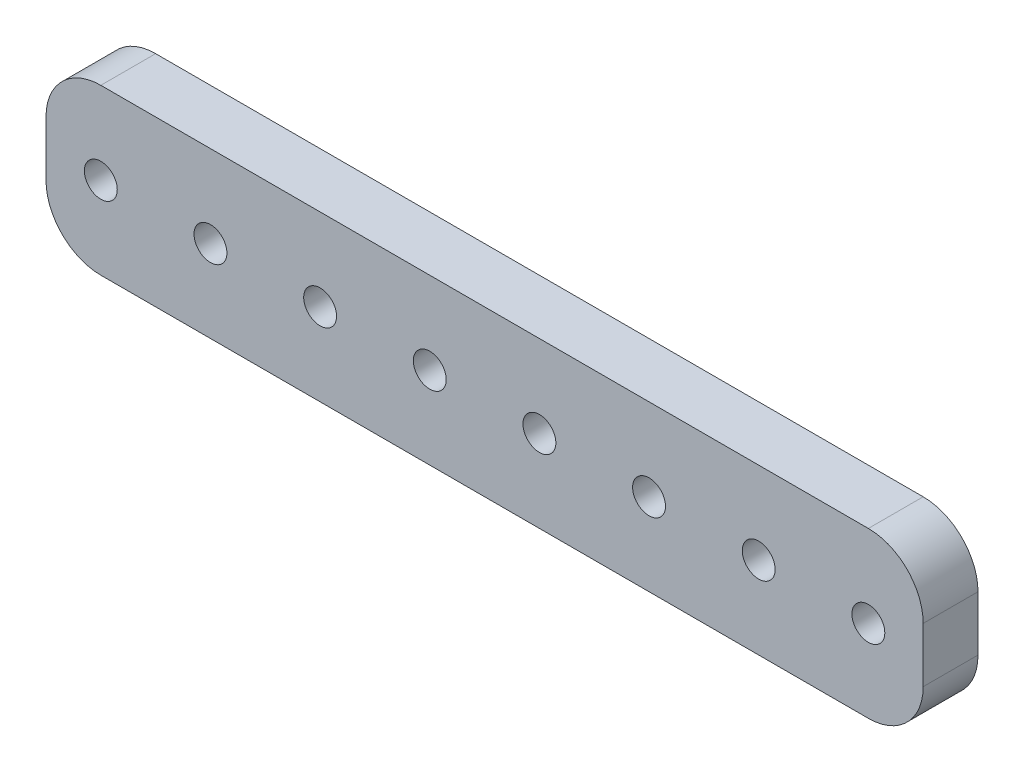
ISO-10303-21;
HEADER;
FILE_DESCRIPTION(('STEP AP214'),'2;1');
FILE_NAME('part.step','',(''),(''),'','','');
FILE_SCHEMA(('AUTOMOTIVE_DESIGN { 1 0 10303 214 1 1 1 1 }'));
ENDSEC;
DATA;
#1=APPLICATION_CONTEXT('core data for automotive mechanical design processes');
#2=APPLICATION_PROTOCOL_DEFINITION('international standard','automotive_design',2000,#1);
#3=PRODUCT_CONTEXT('',#1,'mechanical');
#4=PRODUCT('Part','Part','',(#3));
#5=PRODUCT_RELATED_PRODUCT_CATEGORY('part','',(#4));
#6=PRODUCT_DEFINITION_FORMATION('','',#4);
#7=PRODUCT_DEFINITION_CONTEXT('part definition',#1,'design');
#8=PRODUCT_DEFINITION('design','',#6,#7);
#9=PRODUCT_DEFINITION_SHAPE('','',#8);
#10=(LENGTH_UNIT() NAMED_UNIT(*) SI_UNIT(.MILLI.,.METRE.));
#11=(NAMED_UNIT(*) PLANE_ANGLE_UNIT() SI_UNIT($,.RADIAN.));
#12=(NAMED_UNIT(*) SI_UNIT($,.STERADIAN.) SOLID_ANGLE_UNIT());
#13=UNCERTAINTY_MEASURE_WITH_UNIT(LENGTH_MEASURE(1.E-05),#10,'distance_accuracy_value','');
#14=(GEOMETRIC_REPRESENTATION_CONTEXT(3) GLOBAL_UNCERTAINTY_ASSIGNED_CONTEXT((#13)) GLOBAL_UNIT_ASSIGNED_CONTEXT((#10,
#11,#12)) REPRESENTATION_CONTEXT('',''));
#15=CARTESIAN_POINT('',(0.,0.,0.));
#16=DIRECTION('',(0.,0.,1.));
#17=DIRECTION('',(1.,0.,0.));
#18=AXIS2_PLACEMENT_3D('',#15,#16,#17);
#19=CARTESIAN_POINT('',(80.,15.,10.));
#20=DIRECTION('',(-1.,0.,0.));
#21=DIRECTION('',(0.,0.,1.));
#22=AXIS2_PLACEMENT_3D('',#19,#20,#21);
#23=PLANE('',#22);
#24=DIRECTION('',(0.,1.,0.));
#25=VECTOR('',#24,1.);
#26=CARTESIAN_POINT('',(80.,15.,10.));
#27=LINE('',#26,#25);
#28=CARTESIAN_POINT('',(80.,-5.,10.));
#29=VERTEX_POINT('',#28);
#30=CARTESIAN_POINT('',(80.,5.,10.));
#31=VERTEX_POINT('',#30);
#32=EDGE_CURVE('E120',#29,#31,#27,.T.);
#33=ORIENTED_EDGE('',*,*,#32,.F.);
#34=DIRECTION('',(0.,0.,-1.));
#35=VECTOR('',#34,1.);
#36=CARTESIAN_POINT('',(80.,-5.,10.));
#37=LINE('',#36,#35);
#38=CARTESIAN_POINT('',(80.,-5.,0.));
#39=VERTEX_POINT('',#38);
#40=EDGE_CURVE('E105',#29,#39,#37,.T.);
#41=ORIENTED_EDGE('',*,*,#40,.T.);
#42=DIRECTION('',(0.,1.,0.));
#43=VECTOR('',#42,1.);
#44=CARTESIAN_POINT('',(80.,15.,0.));
#45=LINE('',#44,#43);
#46=CARTESIAN_POINT('',(80.,5.,0.));
#47=VERTEX_POINT('',#46);
#48=EDGE_CURVE('E117',#39,#47,#45,.T.);
#49=ORIENTED_EDGE('',*,*,#48,.T.);
#50=DIRECTION('',(0.,0.,-1.));
#51=VECTOR('',#50,1.);
#52=CARTESIAN_POINT('',(80.,5.,10.));
#53=LINE('',#52,#51);
#54=EDGE_CURVE('E122',#47,#31,#53,.F.);
#55=ORIENTED_EDGE('',*,*,#54,.T.);
#56=EDGE_LOOP('',(#33,#41,#49,#55));
#57=FACE_BOUND('',#56,.T.);
#58=ADVANCED_FACE('F35',(#57),#23,.F.);
#59=CARTESIAN_POINT('',(-80.,15.,10.));
#60=DIRECTION('',(0.,-1.,0.));
#61=DIRECTION('',(0.,0.,-1.));
#62=AXIS2_PLACEMENT_3D('',#59,#60,#61);
#63=PLANE('',#62);
#64=DIRECTION('',(-1.,0.,0.));
#65=VECTOR('',#64,1.);
#66=CARTESIAN_POINT('',(-80.,15.,0.));
#67=LINE('',#66,#65);
#68=CARTESIAN_POINT('',(70.,15.,0.));
#69=VERTEX_POINT('',#68);
#70=CARTESIAN_POINT('',(-70.,15.,0.));
#71=VERTEX_POINT('',#70);
#72=EDGE_CURVE('E126',#69,#71,#67,.T.);
#73=ORIENTED_EDGE('',*,*,#72,.T.);
#74=DIRECTION('',(0.,0.,-1.));
#75=VECTOR('',#74,1.);
#76=CARTESIAN_POINT('',(-70.,15.,10.));
#77=LINE('',#76,#75);
#78=CARTESIAN_POINT('',(-70.,15.,10.));
#79=VERTEX_POINT('',#78);
#80=EDGE_CURVE('E12',#71,#79,#77,.F.);
#81=ORIENTED_EDGE('',*,*,#80,.T.);
#82=DIRECTION('',(-1.,0.,0.));
#83=VECTOR('',#82,1.);
#84=CARTESIAN_POINT('',(-80.,15.,10.));
#85=LINE('',#84,#83);
#86=CARTESIAN_POINT('',(70.,15.,10.));
#87=VERTEX_POINT('',#86);
#88=EDGE_CURVE('E166',#87,#79,#85,.T.);
#89=ORIENTED_EDGE('',*,*,#88,.F.);
#90=DIRECTION('',(0.,0.,-1.));
#91=VECTOR('',#90,1.);
#92=CARTESIAN_POINT('',(70.,15.,10.));
#93=LINE('',#92,#91);
#94=EDGE_CURVE('E43',#87,#69,#93,.T.);
#95=ORIENTED_EDGE('',*,*,#94,.T.);
#96=EDGE_LOOP('',(#73,#81,#89,#95));
#97=FACE_BOUND('',#96,.T.);
#98=ADVANCED_FACE('F164',(#97),#63,.F.);
#99=CARTESIAN_POINT('',(-80.,15.,10.));
#100=DIRECTION('',(1.,0.,0.));
#101=DIRECTION('',(0.,0.,-1.));
#102=AXIS2_PLACEMENT_3D('',#99,#100,#101);
#103=PLANE('',#102);
#104=DIRECTION('',(0.,-1.,0.));
#105=VECTOR('',#104,1.);
#106=CARTESIAN_POINT('',(-80.,15.,0.));
#107=LINE('',#106,#105);
#108=CARTESIAN_POINT('',(-80.,5.,0.));
#109=VERTEX_POINT('',#108);
#110=CARTESIAN_POINT('',(-80.,-5.,0.));
#111=VERTEX_POINT('',#110);
#112=EDGE_CURVE('E130',#109,#111,#107,.T.);
#113=ORIENTED_EDGE('',*,*,#112,.T.);
#114=DIRECTION('',(0.,0.,-1.));
#115=VECTOR('',#114,1.);
#116=CARTESIAN_POINT('',(-80.,-5.,10.));
#117=LINE('',#116,#115);
#118=CARTESIAN_POINT('',(-80.,-5.,10.));
#119=VERTEX_POINT('',#118);
#120=EDGE_CURVE('E50',#111,#119,#117,.F.);
#121=ORIENTED_EDGE('',*,*,#120,.T.);
#122=DIRECTION('',(0.,-1.,0.));
#123=VECTOR('',#122,1.);
#124=CARTESIAN_POINT('',(-80.,15.,10.));
#125=LINE('',#124,#123);
#126=CARTESIAN_POINT('',(-80.,5.,10.));
#127=VERTEX_POINT('',#126);
#128=EDGE_CURVE('E174',#127,#119,#125,.T.);
#129=ORIENTED_EDGE('',*,*,#128,.F.);
#130=DIRECTION('',(0.,0.,-1.));
#131=VECTOR('',#130,1.);
#132=CARTESIAN_POINT('',(-80.,5.,10.));
#133=LINE('',#132,#131);
#134=EDGE_CURVE('E157',#127,#109,#133,.T.);
#135=ORIENTED_EDGE('',*,*,#134,.T.);
#136=EDGE_LOOP('',(#113,#121,#129,#135));
#137=FACE_BOUND('',#136,.T.);
#138=ADVANCED_FACE('F173',(#137),#103,.F.);
#139=CARTESIAN_POINT('',(-80.,-15.,10.));
#140=DIRECTION('',(0.,1.,0.));
#141=DIRECTION('',(0.,0.,1.));
#142=AXIS2_PLACEMENT_3D('',#139,#140,#141);
#143=PLANE('',#142);
#144=DIRECTION('',(1.,0.,0.));
#145=VECTOR('',#144,1.);
#146=CARTESIAN_POINT('',(-80.,-15.,0.));
#147=LINE('',#146,#145);
#148=CARTESIAN_POINT('',(-70.,-15.,0.));
#149=VERTEX_POINT('',#148);
#150=CARTESIAN_POINT('',(70.,-15.,0.));
#151=VERTEX_POINT('',#150);
#152=EDGE_CURVE('E140',#149,#151,#147,.T.);
#153=ORIENTED_EDGE('',*,*,#152,.T.);
#154=DIRECTION('',(0.,0.,-1.));
#155=VECTOR('',#154,1.);
#156=CARTESIAN_POINT('',(70.,-15.,10.));
#157=LINE('',#156,#155);
#158=CARTESIAN_POINT('',(70.,-15.,10.));
#159=VERTEX_POINT('',#158);
#160=EDGE_CURVE('E106',#151,#159,#157,.F.);
#161=ORIENTED_EDGE('',*,*,#160,.T.);
#162=DIRECTION('',(1.,0.,0.));
#163=VECTOR('',#162,1.);
#164=CARTESIAN_POINT('',(-80.,-15.,10.));
#165=LINE('',#164,#163);
#166=CARTESIAN_POINT('',(-70.,-15.,10.));
#167=VERTEX_POINT('',#166);
#168=EDGE_CURVE('E136',#167,#159,#165,.T.);
#169=ORIENTED_EDGE('',*,*,#168,.F.);
#170=DIRECTION('',(0.,0.,-1.));
#171=VECTOR('',#170,1.);
#172=CARTESIAN_POINT('',(-70.,-15.,10.));
#173=LINE('',#172,#171);
#174=EDGE_CURVE('E111',#167,#149,#173,.T.);
#175=ORIENTED_EDGE('',*,*,#174,.T.);
#176=EDGE_LOOP('',(#153,#161,#169,#175));
#177=FACE_BOUND('',#176,.T.);
#178=ADVANCED_FACE('F230',(#177),#143,.F.);
#179=CARTESIAN_POINT('',(0.,0.,10.));
#180=DIRECTION('',(0.,0.,1.));
#181=DIRECTION('',(1.,0.,0.));
#182=AXIS2_PLACEMENT_3D('',#179,#180,#181);
#183=PLANE('',#182);
#184=CARTESIAN_POINT('',(9.99999999999997,0.,10.));
#185=DIRECTION('',(0.,0.,1.));
#186=DIRECTION('',(1.,0.,0.));
#187=AXIS2_PLACEMENT_3D('',#184,#185,#186);
#188=CIRCLE('',#187,3.);
#189=CARTESIAN_POINT('',(13.,0.,10.));
#190=VERTEX_POINT('',#189);
#191=EDGE_CURVE('E221',#190,#190,#188,.T.);
#192=ORIENTED_EDGE('',*,*,#191,.F.);
#193=EDGE_LOOP('',(#192));
#194=FACE_BOUND('',#193,.T.);
#195=CARTESIAN_POINT('',(-10.,0.,10.));
#196=DIRECTION('',(0.,0.,1.));
#197=DIRECTION('',(1.,0.,0.));
#198=AXIS2_PLACEMENT_3D('',#195,#196,#197);
#199=CIRCLE('',#198,3.00000000000001);
#200=CARTESIAN_POINT('',(-7.00000000000002,0.,10.));
#201=VERTEX_POINT('',#200);
#202=EDGE_CURVE('E215',#201,#201,#199,.T.);
#203=ORIENTED_EDGE('',*,*,#202,.F.);
#204=EDGE_LOOP('',(#203));
#205=FACE_BOUND('',#204,.T.);
#206=CARTESIAN_POINT('',(70.,0.,10.));
#207=DIRECTION('',(0.,0.,1.));
#208=DIRECTION('',(1.,0.,0.));
#209=AXIS2_PLACEMENT_3D('',#206,#207,#208);
#210=CIRCLE('',#209,2.99999999999999);
#211=CARTESIAN_POINT('',(73.,0.,10.));
#212=VERTEX_POINT('',#211);
#213=EDGE_CURVE('E209',#212,#212,#210,.T.);
#214=ORIENTED_EDGE('',*,*,#213,.F.);
#215=EDGE_LOOP('',(#214));
#216=FACE_BOUND('',#215,.T.);
#217=CARTESIAN_POINT('',(50.,0.,10.));
#218=DIRECTION('',(0.,0.,1.));
#219=DIRECTION('',(1.,0.,0.));
#220=AXIS2_PLACEMENT_3D('',#217,#218,#219);
#221=CIRCLE('',#220,3.00000000000001);
#222=CARTESIAN_POINT('',(53.,0.,10.));
#223=VERTEX_POINT('',#222);
#224=EDGE_CURVE('E203',#223,#223,#221,.T.);
#225=ORIENTED_EDGE('',*,*,#224,.F.);
#226=EDGE_LOOP('',(#225));
#227=FACE_BOUND('',#226,.T.);
#228=CARTESIAN_POINT('',(-50.,0.,10.));
#229=DIRECTION('',(0.,0.,1.));
#230=DIRECTION('',(1.,0.,0.));
#231=AXIS2_PLACEMENT_3D('',#228,#229,#230);
#232=CIRCLE('',#231,3.00000000000001);
#233=CARTESIAN_POINT('',(-47.,0.,10.));
#234=VERTEX_POINT('',#233);
#235=EDGE_CURVE('E197',#234,#234,#232,.T.);
#236=ORIENTED_EDGE('',*,*,#235,.F.);
#237=EDGE_LOOP('',(#236));
#238=FACE_BOUND('',#237,.T.);
#239=CARTESIAN_POINT('',(-70.,0.,10.));
#240=DIRECTION('',(0.,0.,1.));
#241=DIRECTION('',(1.,0.,0.));
#242=AXIS2_PLACEMENT_3D('',#239,#240,#241);
#243=CIRCLE('',#242,2.99999999999999);
#244=CARTESIAN_POINT('',(-67.,0.,10.));
#245=VERTEX_POINT('',#244);
#246=EDGE_CURVE('E191',#245,#245,#243,.T.);
#247=ORIENTED_EDGE('',*,*,#246,.F.);
#248=EDGE_LOOP('',(#247));
#249=FACE_BOUND('',#248,.T.);
#250=CARTESIAN_POINT('',(-30.,0.,10.));
#251=DIRECTION('',(0.,0.,1.));
#252=DIRECTION('',(1.,0.,0.));
#253=AXIS2_PLACEMENT_3D('',#250,#251,#252);
#254=CIRCLE('',#253,3.00000000000001);
#255=CARTESIAN_POINT('',(-27.,0.,10.));
#256=VERTEX_POINT('',#255);
#257=EDGE_CURVE('E185',#256,#256,#254,.T.);
#258=ORIENTED_EDGE('',*,*,#257,.F.);
#259=EDGE_LOOP('',(#258));
#260=FACE_BOUND('',#259,.T.);
#261=CARTESIAN_POINT('',(30.,0.,10.));
#262=DIRECTION('',(0.,0.,1.));
#263=DIRECTION('',(1.,0.,0.));
#264=AXIS2_PLACEMENT_3D('',#261,#262,#263);
#265=CIRCLE('',#264,3.00000000000001);
#266=CARTESIAN_POINT('',(33.,0.,10.));
#267=VERTEX_POINT('',#266);
#268=EDGE_CURVE('E133',#267,#267,#265,.T.);
#269=ORIENTED_EDGE('',*,*,#268,.F.);
#270=EDGE_LOOP('',(#269));
#271=FACE_BOUND('',#270,.T.);
#272=ORIENTED_EDGE('',*,*,#168,.T.);
#273=CARTESIAN_POINT('',(70.,-5.,10.));
#274=DIRECTION('',(0.,0.,1.));
#275=DIRECTION('',(1.,0.,0.));
#276=AXIS2_PLACEMENT_3D('',#273,#274,#275);
#277=CIRCLE('',#276,10.);
#278=EDGE_CURVE('E155',#159,#29,#277,.T.);
#279=ORIENTED_EDGE('',*,*,#278,.T.);
#280=ORIENTED_EDGE('',*,*,#32,.T.);
#281=CARTESIAN_POINT('',(70.,5.,10.));
#282=DIRECTION('',(0.,0.,1.));
#283=DIRECTION('',(1.,0.,0.));
#284=AXIS2_PLACEMENT_3D('',#281,#282,#283);
#285=CIRCLE('',#284,10.);
#286=EDGE_CURVE('E150',#31,#87,#285,.T.);
#287=ORIENTED_EDGE('',*,*,#286,.T.);
#288=ORIENTED_EDGE('',*,*,#88,.T.);
#289=CARTESIAN_POINT('',(-70.,5.,10.));
#290=DIRECTION('',(0.,0.,1.));
#291=DIRECTION('',(1.,0.,0.));
#292=AXIS2_PLACEMENT_3D('',#289,#290,#291);
#293=CIRCLE('',#292,10.);
#294=EDGE_CURVE('E57',#79,#127,#293,.T.);
#295=ORIENTED_EDGE('',*,*,#294,.T.);
#296=ORIENTED_EDGE('',*,*,#128,.T.);
#297=CARTESIAN_POINT('',(-70.,-5.,10.));
#298=DIRECTION('',(0.,0.,1.));
#299=DIRECTION('',(1.,0.,0.));
#300=AXIS2_PLACEMENT_3D('',#297,#298,#299);
#301=CIRCLE('',#300,10.);
#302=EDGE_CURVE('E153',#119,#167,#301,.T.);
#303=ORIENTED_EDGE('',*,*,#302,.T.);
#304=EDGE_LOOP('',(#272,#279,#280,#287,#288,#295,#296,#303));
#305=FACE_BOUND('',#304,.T.);
#306=ADVANCED_FACE('F227',(#194,#205,#216,#227,#238,#249,#260,#271,#305),#183,.T.);
#307=CARTESIAN_POINT('',(0.,0.,0.));
#308=DIRECTION('',(0.,0.,1.));
#309=DIRECTION('',(1.,0.,0.));
#310=AXIS2_PLACEMENT_3D('',#307,#308,#309);
#311=PLANE('',#310);
#312=ORIENTED_EDGE('',*,*,#48,.F.);
#313=CARTESIAN_POINT('',(70.,-5.,0.));
#314=DIRECTION('',(0.,0.,1.));
#315=DIRECTION('',(1.,0.,0.));
#316=AXIS2_PLACEMENT_3D('',#313,#314,#315);
#317=CIRCLE('',#316,10.);
#318=EDGE_CURVE('E101',#39,#151,#317,.F.);
#319=ORIENTED_EDGE('',*,*,#318,.T.);
#320=ORIENTED_EDGE('',*,*,#152,.F.);
#321=CARTESIAN_POINT('',(-70.,-5.,0.));
#322=DIRECTION('',(0.,0.,1.));
#323=DIRECTION('',(1.,0.,0.));
#324=AXIS2_PLACEMENT_3D('',#321,#322,#323);
#325=CIRCLE('',#324,10.);
#326=EDGE_CURVE('E112',#149,#111,#325,.F.);
#327=ORIENTED_EDGE('',*,*,#326,.T.);
#328=ORIENTED_EDGE('',*,*,#112,.F.);
#329=CARTESIAN_POINT('',(-70.,5.,0.));
#330=DIRECTION('',(0.,0.,1.));
#331=DIRECTION('',(1.,0.,0.));
#332=AXIS2_PLACEMENT_3D('',#329,#330,#331);
#333=CIRCLE('',#332,10.);
#334=EDGE_CURVE('E144',#109,#71,#333,.F.);
#335=ORIENTED_EDGE('',*,*,#334,.T.);
#336=ORIENTED_EDGE('',*,*,#72,.F.);
#337=CARTESIAN_POINT('',(70.,5.,0.));
#338=DIRECTION('',(0.,0.,1.));
#339=DIRECTION('',(1.,0.,0.));
#340=AXIS2_PLACEMENT_3D('',#337,#338,#339);
#341=CIRCLE('',#340,10.);
#342=EDGE_CURVE('E121',#69,#47,#341,.F.);
#343=ORIENTED_EDGE('',*,*,#342,.T.);
#344=EDGE_LOOP('',(#312,#319,#320,#327,#328,#335,#336,#343));
#345=FACE_BOUND('',#344,.T.);
#346=ADVANCED_FACE('F124',(#345),#311,.F.);
#347=CARTESIAN_POINT('',(30.,0.,-8.48528137423859));
#348=DIRECTION('',(0.,0.,1.));
#349=DIRECTION('',(1.,0.,0.));
#350=AXIS2_PLACEMENT_3D('',#347,#348,#349);
#351=CYLINDRICAL_SURFACE('',#350,3.00000000000001);
#352=CARTESIAN_POINT('',(30.,0.,0.200000000000001));
#353=DIRECTION('',(0.,0.,1.));
#354=DIRECTION('',(1.,0.,0.));
#355=AXIS2_PLACEMENT_3D('',#352,#353,#354);
#356=CIRCLE('',#355,3.00000000000001);
#357=CARTESIAN_POINT('',(33.,0.,0.200000000000001));
#358=VERTEX_POINT('',#357);
#359=EDGE_CURVE('E127',#358,#358,#356,.F.);
#360=ORIENTED_EDGE('',*,*,#359,.T.);
#361=EDGE_LOOP('',(#360));
#362=FACE_BOUND('',#361,.T.);
#363=ORIENTED_EDGE('',*,*,#268,.T.);
#364=EDGE_LOOP('',(#363));
#365=FACE_BOUND('',#364,.T.);
#366=ADVANCED_FACE('F270',(#362,#365),#351,.F.);
#367=CARTESIAN_POINT('',(0.,0.,0.2));
#368=DIRECTION('',(0.,0.,1.));
#369=DIRECTION('',(1.,0.,0.));
#370=AXIS2_PLACEMENT_3D('',#367,#368,#369);
#371=PLANE('',#370);
#372=ORIENTED_EDGE('',*,*,#359,.F.);
#373=EDGE_LOOP('',(#372));
#374=FACE_BOUND('',#373,.T.);
#375=ADVANCED_FACE('F274',(#374),#371,.T.);
#376=CARTESIAN_POINT('',(-30.,0.,-8.48528137423859));
#377=DIRECTION('',(0.,0.,1.));
#378=DIRECTION('',(1.,0.,0.));
#379=AXIS2_PLACEMENT_3D('',#376,#377,#378);
#380=CYLINDRICAL_SURFACE('',#379,3.00000000000001);
#381=CARTESIAN_POINT('',(-30.,0.,0.200000000000001));
#382=DIRECTION('',(0.,0.,1.));
#383=DIRECTION('',(1.,0.,0.));
#384=AXIS2_PLACEMENT_3D('',#381,#382,#383);
#385=CIRCLE('',#384,3.00000000000001);
#386=CARTESIAN_POINT('',(-27.,0.,0.200000000000001));
#387=VERTEX_POINT('',#386);
#388=EDGE_CURVE('E182',#387,#387,#385,.F.);
#389=ORIENTED_EDGE('',*,*,#388,.T.);
#390=EDGE_LOOP('',(#389));
#391=FACE_BOUND('',#390,.T.);
#392=ORIENTED_EDGE('',*,*,#257,.T.);
#393=EDGE_LOOP('',(#392));
#394=FACE_BOUND('',#393,.T.);
#395=ADVANCED_FACE('F278',(#391,#394),#380,.F.);
#396=CARTESIAN_POINT('',(0.,0.,0.2));
#397=DIRECTION('',(0.,0.,1.));
#398=DIRECTION('',(1.,0.,0.));
#399=AXIS2_PLACEMENT_3D('',#396,#397,#398);
#400=PLANE('',#399);
#401=ORIENTED_EDGE('',*,*,#388,.F.);
#402=EDGE_LOOP('',(#401));
#403=FACE_BOUND('',#402,.T.);
#404=ADVANCED_FACE('F282',(#403),#400,.T.);
#405=CARTESIAN_POINT('',(-70.,0.,-8.48528137423859));
#406=DIRECTION('',(0.,0.,1.));
#407=DIRECTION('',(1.,0.,0.));
#408=AXIS2_PLACEMENT_3D('',#405,#406,#407);
#409=CYLINDRICAL_SURFACE('',#408,2.99999999999999);
#410=CARTESIAN_POINT('',(-70.,0.,0.200000000000001));
#411=DIRECTION('',(0.,0.,1.));
#412=DIRECTION('',(1.,0.,0.));
#413=AXIS2_PLACEMENT_3D('',#410,#411,#412);
#414=CIRCLE('',#413,2.99999999999999);
#415=CARTESIAN_POINT('',(-67.,0.,0.200000000000001));
#416=VERTEX_POINT('',#415);
#417=EDGE_CURVE('E188',#416,#416,#414,.F.);
#418=ORIENTED_EDGE('',*,*,#417,.T.);
#419=EDGE_LOOP('',(#418));
#420=FACE_BOUND('',#419,.T.);
#421=ORIENTED_EDGE('',*,*,#246,.T.);
#422=EDGE_LOOP('',(#421));
#423=FACE_BOUND('',#422,.T.);
#424=ADVANCED_FACE('F286',(#420,#423),#409,.F.);
#425=CARTESIAN_POINT('',(0.,0.,0.2));
#426=DIRECTION('',(0.,0.,1.));
#427=DIRECTION('',(1.,0.,0.));
#428=AXIS2_PLACEMENT_3D('',#425,#426,#427);
#429=PLANE('',#428);
#430=ORIENTED_EDGE('',*,*,#417,.F.);
#431=EDGE_LOOP('',(#430));
#432=FACE_BOUND('',#431,.T.);
#433=ADVANCED_FACE('F290',(#432),#429,.T.);
#434=CARTESIAN_POINT('',(-50.,0.,-8.48528137423859));
#435=DIRECTION('',(0.,0.,1.));
#436=DIRECTION('',(1.,0.,0.));
#437=AXIS2_PLACEMENT_3D('',#434,#435,#436);
#438=CYLINDRICAL_SURFACE('',#437,3.00000000000001);
#439=CARTESIAN_POINT('',(-50.,0.,0.200000000000001));
#440=DIRECTION('',(0.,0.,1.));
#441=DIRECTION('',(1.,0.,0.));
#442=AXIS2_PLACEMENT_3D('',#439,#440,#441);
#443=CIRCLE('',#442,3.00000000000001);
#444=CARTESIAN_POINT('',(-47.,0.,0.200000000000001));
#445=VERTEX_POINT('',#444);
#446=EDGE_CURVE('E194',#445,#445,#443,.F.);
#447=ORIENTED_EDGE('',*,*,#446,.T.);
#448=EDGE_LOOP('',(#447));
#449=FACE_BOUND('',#448,.T.);
#450=ORIENTED_EDGE('',*,*,#235,.T.);
#451=EDGE_LOOP('',(#450));
#452=FACE_BOUND('',#451,.T.);
#453=ADVANCED_FACE('F294',(#449,#452),#438,.F.);
#454=CARTESIAN_POINT('',(0.,0.,0.2));
#455=DIRECTION('',(0.,0.,1.));
#456=DIRECTION('',(1.,0.,0.));
#457=AXIS2_PLACEMENT_3D('',#454,#455,#456);
#458=PLANE('',#457);
#459=ORIENTED_EDGE('',*,*,#446,.F.);
#460=EDGE_LOOP('',(#459));
#461=FACE_BOUND('',#460,.T.);
#462=ADVANCED_FACE('F298',(#461),#458,.T.);
#463=CARTESIAN_POINT('',(50.,0.,-8.48528137423859));
#464=DIRECTION('',(0.,0.,1.));
#465=DIRECTION('',(1.,0.,0.));
#466=AXIS2_PLACEMENT_3D('',#463,#464,#465);
#467=CYLINDRICAL_SURFACE('',#466,3.00000000000001);
#468=CARTESIAN_POINT('',(50.,0.,0.200000000000001));
#469=DIRECTION('',(0.,0.,1.));
#470=DIRECTION('',(1.,0.,0.));
#471=AXIS2_PLACEMENT_3D('',#468,#469,#470);
#472=CIRCLE('',#471,3.00000000000001);
#473=CARTESIAN_POINT('',(53.,0.,0.200000000000001));
#474=VERTEX_POINT('',#473);
#475=EDGE_CURVE('E200',#474,#474,#472,.F.);
#476=ORIENTED_EDGE('',*,*,#475,.T.);
#477=EDGE_LOOP('',(#476));
#478=FACE_BOUND('',#477,.T.);
#479=ORIENTED_EDGE('',*,*,#224,.T.);
#480=EDGE_LOOP('',(#479));
#481=FACE_BOUND('',#480,.T.);
#482=ADVANCED_FACE('F302',(#478,#481),#467,.F.);
#483=CARTESIAN_POINT('',(0.,0.,0.2));
#484=DIRECTION('',(0.,0.,1.));
#485=DIRECTION('',(1.,0.,0.));
#486=AXIS2_PLACEMENT_3D('',#483,#484,#485);
#487=PLANE('',#486);
#488=ORIENTED_EDGE('',*,*,#475,.F.);
#489=EDGE_LOOP('',(#488));
#490=FACE_BOUND('',#489,.T.);
#491=ADVANCED_FACE('F306',(#490),#487,.T.);
#492=CARTESIAN_POINT('',(70.,0.,-8.48528137423859));
#493=DIRECTION('',(0.,0.,1.));
#494=DIRECTION('',(1.,0.,0.));
#495=AXIS2_PLACEMENT_3D('',#492,#493,#494);
#496=CYLINDRICAL_SURFACE('',#495,2.99999999999999);
#497=CARTESIAN_POINT('',(70.,0.,0.200000000000001));
#498=DIRECTION('',(0.,0.,1.));
#499=DIRECTION('',(1.,0.,0.));
#500=AXIS2_PLACEMENT_3D('',#497,#498,#499);
#501=CIRCLE('',#500,2.99999999999999);
#502=CARTESIAN_POINT('',(73.,0.,0.200000000000001));
#503=VERTEX_POINT('',#502);
#504=EDGE_CURVE('E206',#503,#503,#501,.F.);
#505=ORIENTED_EDGE('',*,*,#504,.T.);
#506=EDGE_LOOP('',(#505));
#507=FACE_BOUND('',#506,.T.);
#508=ORIENTED_EDGE('',*,*,#213,.T.);
#509=EDGE_LOOP('',(#508));
#510=FACE_BOUND('',#509,.T.);
#511=ADVANCED_FACE('F310',(#507,#510),#496,.F.);
#512=CARTESIAN_POINT('',(0.,0.,0.2));
#513=DIRECTION('',(0.,0.,1.));
#514=DIRECTION('',(1.,0.,0.));
#515=AXIS2_PLACEMENT_3D('',#512,#513,#514);
#516=PLANE('',#515);
#517=ORIENTED_EDGE('',*,*,#504,.F.);
#518=EDGE_LOOP('',(#517));
#519=FACE_BOUND('',#518,.T.);
#520=ADVANCED_FACE('F314',(#519),#516,.T.);
#521=CARTESIAN_POINT('',(-10.,0.,-8.48528137423859));
#522=DIRECTION('',(0.,0.,1.));
#523=DIRECTION('',(1.,0.,0.));
#524=AXIS2_PLACEMENT_3D('',#521,#522,#523);
#525=CYLINDRICAL_SURFACE('',#524,3.00000000000001);
#526=CARTESIAN_POINT('',(-10.,0.,0.200000000000001));
#527=DIRECTION('',(0.,0.,1.));
#528=DIRECTION('',(1.,0.,0.));
#529=AXIS2_PLACEMENT_3D('',#526,#527,#528);
#530=CIRCLE('',#529,3.00000000000001);
#531=CARTESIAN_POINT('',(-7.00000000000002,0.,0.200000000000001));
#532=VERTEX_POINT('',#531);
#533=EDGE_CURVE('E212',#532,#532,#530,.F.);
#534=ORIENTED_EDGE('',*,*,#533,.T.);
#535=EDGE_LOOP('',(#534));
#536=FACE_BOUND('',#535,.T.);
#537=ORIENTED_EDGE('',*,*,#202,.T.);
#538=EDGE_LOOP('',(#537));
#539=FACE_BOUND('',#538,.T.);
#540=ADVANCED_FACE('F318',(#536,#539),#525,.F.);
#541=CARTESIAN_POINT('',(0.,0.,0.2));
#542=DIRECTION('',(0.,0.,1.));
#543=DIRECTION('',(1.,0.,0.));
#544=AXIS2_PLACEMENT_3D('',#541,#542,#543);
#545=PLANE('',#544);
#546=ORIENTED_EDGE('',*,*,#533,.F.);
#547=EDGE_LOOP('',(#546));
#548=FACE_BOUND('',#547,.T.);
#549=ADVANCED_FACE('F322',(#548),#545,.T.);
#550=CARTESIAN_POINT('',(9.99999999999997,0.,-8.48528137423859));
#551=DIRECTION('',(0.,0.,1.));
#552=DIRECTION('',(1.,0.,0.));
#553=AXIS2_PLACEMENT_3D('',#550,#551,#552);
#554=CYLINDRICAL_SURFACE('',#553,3.);
#555=CARTESIAN_POINT('',(9.99999999999997,0.,0.200000000000001));
#556=DIRECTION('',(0.,0.,1.));
#557=DIRECTION('',(1.,0.,0.));
#558=AXIS2_PLACEMENT_3D('',#555,#556,#557);
#559=CIRCLE('',#558,3.);
#560=CARTESIAN_POINT('',(13.,0.,0.200000000000001));
#561=VERTEX_POINT('',#560);
#562=EDGE_CURVE('E218',#561,#561,#559,.F.);
#563=ORIENTED_EDGE('',*,*,#562,.T.);
#564=EDGE_LOOP('',(#563));
#565=FACE_BOUND('',#564,.T.);
#566=ORIENTED_EDGE('',*,*,#191,.T.);
#567=EDGE_LOOP('',(#566));
#568=FACE_BOUND('',#567,.T.);
#569=ADVANCED_FACE('F225',(#565,#568),#554,.F.);
#570=CARTESIAN_POINT('',(0.,0.,0.2));
#571=DIRECTION('',(0.,0.,1.));
#572=DIRECTION('',(1.,0.,0.));
#573=AXIS2_PLACEMENT_3D('',#570,#571,#572);
#574=PLANE('',#573);
#575=ORIENTED_EDGE('',*,*,#562,.F.);
#576=EDGE_LOOP('',(#575));
#577=FACE_BOUND('',#576,.T.);
#578=ADVANCED_FACE('F256',(#577),#574,.T.);
#579=CARTESIAN_POINT('',(70.,-5.,10.));
#580=DIRECTION('',(0.,0.,-1.));
#581=DIRECTION('',(-1.,0.,0.));
#582=AXIS2_PLACEMENT_3D('',#579,#580,#581);
#583=CYLINDRICAL_SURFACE('',#582,10.);
#584=ORIENTED_EDGE('',*,*,#278,.F.);
#585=ORIENTED_EDGE('',*,*,#160,.F.);
#586=ORIENTED_EDGE('',*,*,#318,.F.);
#587=ORIENTED_EDGE('',*,*,#40,.F.);
#588=EDGE_LOOP('',(#584,#585,#586,#587));
#589=FACE_BOUND('',#588,.T.);
#590=ADVANCED_FACE('F104',(#589),#583,.T.);
#591=CARTESIAN_POINT('',(-70.,-5.,10.));
#592=DIRECTION('',(0.,0.,-1.));
#593=DIRECTION('',(-1.,0.,0.));
#594=AXIS2_PLACEMENT_3D('',#591,#592,#593);
#595=CYLINDRICAL_SURFACE('',#594,10.);
#596=ORIENTED_EDGE('',*,*,#302,.F.);
#597=ORIENTED_EDGE('',*,*,#120,.F.);
#598=ORIENTED_EDGE('',*,*,#326,.F.);
#599=ORIENTED_EDGE('',*,*,#174,.F.);
#600=EDGE_LOOP('',(#596,#597,#598,#599));
#601=FACE_BOUND('',#600,.T.);
#602=ADVANCED_FACE('F249',(#601),#595,.T.);
#603=CARTESIAN_POINT('',(-70.,5.,10.));
#604=DIRECTION('',(0.,0.,-1.));
#605=DIRECTION('',(-1.,0.,0.));
#606=AXIS2_PLACEMENT_3D('',#603,#604,#605);
#607=CYLINDRICAL_SURFACE('',#606,10.);
#608=ORIENTED_EDGE('',*,*,#294,.F.);
#609=ORIENTED_EDGE('',*,*,#80,.F.);
#610=ORIENTED_EDGE('',*,*,#334,.F.);
#611=ORIENTED_EDGE('',*,*,#134,.F.);
#612=EDGE_LOOP('',(#608,#609,#610,#611));
#613=FACE_BOUND('',#612,.T.);
#614=ADVANCED_FACE('F172',(#613),#607,.T.);
#615=CARTESIAN_POINT('',(70.,5.,10.));
#616=DIRECTION('',(0.,0.,-1.));
#617=DIRECTION('',(-1.,0.,0.));
#618=AXIS2_PLACEMENT_3D('',#615,#616,#617);
#619=CYLINDRICAL_SURFACE('',#618,10.);
#620=ORIENTED_EDGE('',*,*,#286,.F.);
#621=ORIENTED_EDGE('',*,*,#54,.F.);
#622=ORIENTED_EDGE('',*,*,#342,.F.);
#623=ORIENTED_EDGE('',*,*,#94,.F.);
#624=EDGE_LOOP('',(#620,#621,#622,#623));
#625=FACE_BOUND('',#624,.T.);
#626=ADVANCED_FACE('F37',(#625),#619,.T.);
#627=CLOSED_SHELL('',(#58,#98,#138,#178,#306,#346,#366,#375,#395,#404,#424,#433,#453,#462,#482,
#491,#511,#520,#540,#549,#569,#578,#590,#602,#614,#626));
#628=MANIFOLD_SOLID_BREP('B2',#627);
#629=ADVANCED_BREP_SHAPE_REPRESENTATION('',(#18,#628),#14);
#630=SHAPE_DEFINITION_REPRESENTATION(#9,#629);
ENDSEC;
END-ISO-10303-21;
